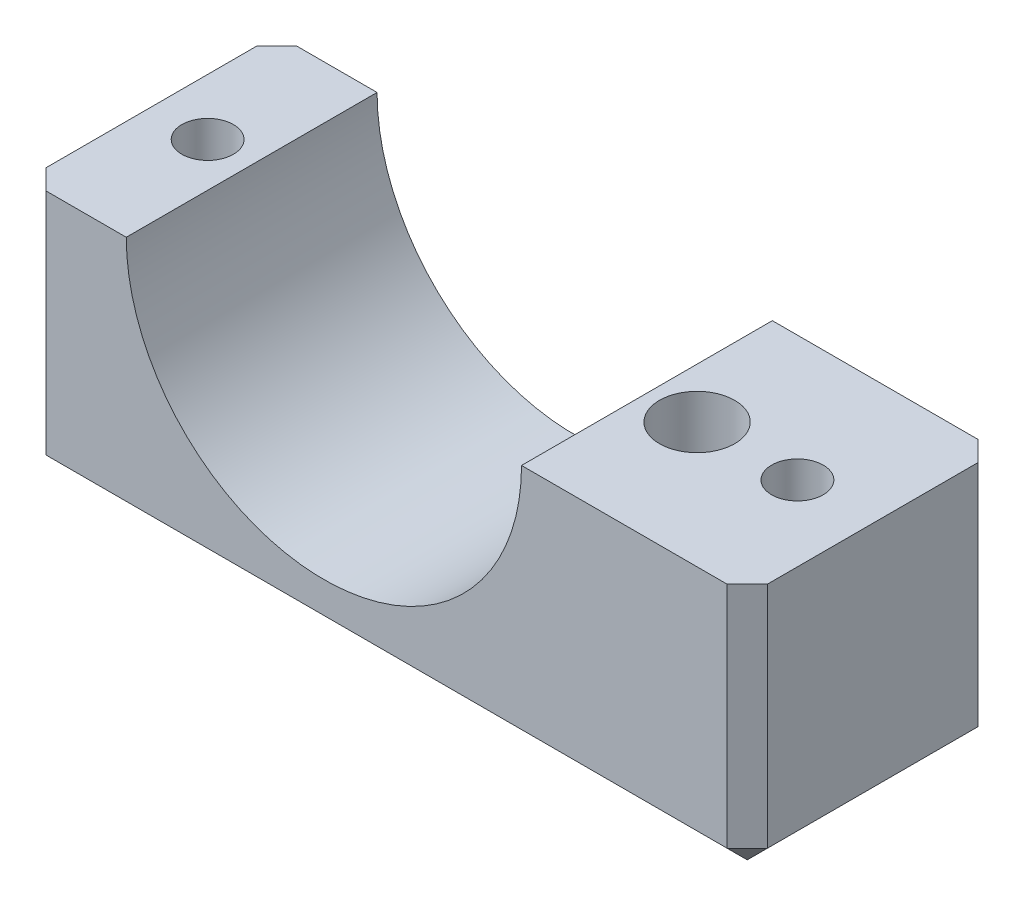
ISO-10303-21;
HEADER;
FILE_DESCRIPTION(('STEP AP214'),'2;1');
FILE_NAME('part.step','',(''),(''),'','','');
FILE_SCHEMA(('AUTOMOTIVE_DESIGN { 1 0 10303 214 1 1 1 1 }'));
ENDSEC;
DATA;
#1=APPLICATION_CONTEXT('core data for automotive mechanical design processes');
#2=APPLICATION_PROTOCOL_DEFINITION('international standard','automotive_design',2000,#1);
#3=PRODUCT_CONTEXT('',#1,'mechanical');
#4=PRODUCT('Part','Part','',(#3));
#5=PRODUCT_RELATED_PRODUCT_CATEGORY('part','',(#4));
#6=PRODUCT_DEFINITION_FORMATION('','',#4);
#7=PRODUCT_DEFINITION_CONTEXT('part definition',#1,'design');
#8=PRODUCT_DEFINITION('design','',#6,#7);
#9=PRODUCT_DEFINITION_SHAPE('','',#8);
#10=(LENGTH_UNIT() NAMED_UNIT(*) SI_UNIT(.MILLI.,.METRE.));
#11=(NAMED_UNIT(*) PLANE_ANGLE_UNIT() SI_UNIT($,.RADIAN.));
#12=(NAMED_UNIT(*) SI_UNIT($,.STERADIAN.) SOLID_ANGLE_UNIT());
#13=UNCERTAINTY_MEASURE_WITH_UNIT(LENGTH_MEASURE(1.E-05),#10,'distance_accuracy_value','');
#14=(GEOMETRIC_REPRESENTATION_CONTEXT(3) GLOBAL_UNCERTAINTY_ASSIGNED_CONTEXT((#13)) GLOBAL_UNIT_ASSIGNED_CONTEXT((#10,
#11,#12)) REPRESENTATION_CONTEXT('',''));
#15=CARTESIAN_POINT('',(0.,0.,0.));
#16=DIRECTION('',(0.,0.,1.));
#17=DIRECTION('',(1.,0.,0.));
#18=AXIS2_PLACEMENT_3D('',#15,#16,#17);
#19=CARTESIAN_POINT('',(0.,-31.496,31.75));
#20=DIRECTION('',(1.,0.,0.));
#21=DIRECTION('',(0.,0.,-1.));
#22=AXIS2_PLACEMENT_3D('',#19,#20,#21);
#23=PLANE('',#22);
#24=DIRECTION('',(0.,0.,1.));
#25=VECTOR('',#24,1.);
#26=CARTESIAN_POINT('',(0.,-28.956,31.75));
#27=LINE('',#26,#25);
#28=CARTESIAN_POINT('',(0.,-28.956,2.53999999999999));
#29=VERTEX_POINT('',#28);
#30=CARTESIAN_POINT('',(0.,-28.956,29.21));
#31=VERTEX_POINT('',#30);
#32=EDGE_CURVE('E189',#29,#31,#27,.T.);
#33=ORIENTED_EDGE('',*,*,#32,.T.);
#34=DIRECTION('',(0.,1.,0.));
#35=VECTOR('',#34,1.);
#36=CARTESIAN_POINT('',(0.,0.,29.21));
#37=LINE('',#36,#35);
#38=CARTESIAN_POINT('',(0.,0.,29.21));
#39=VERTEX_POINT('',#38);
#40=EDGE_CURVE('E191',#31,#39,#37,.T.);
#41=ORIENTED_EDGE('',*,*,#40,.T.);
#42=DIRECTION('',(0.,0.,-1.));
#43=VECTOR('',#42,1.);
#44=CARTESIAN_POINT('',(0.,0.,31.75));
#45=LINE('',#44,#43);
#46=CARTESIAN_POINT('',(0.,0.,2.53999999999999));
#47=VERTEX_POINT('',#46);
#48=EDGE_CURVE('E151',#39,#47,#45,.T.);
#49=ORIENTED_EDGE('',*,*,#48,.T.);
#50=DIRECTION('',(0.,-1.,0.));
#51=VECTOR('',#50,1.);
#52=CARTESIAN_POINT('',(0.,-31.496,2.53999999999999));
#53=LINE('',#52,#51);
#54=EDGE_CURVE('E187',#47,#29,#53,.T.);
#55=ORIENTED_EDGE('',*,*,#54,.T.);
#56=EDGE_LOOP('',(#33,#41,#49,#55));
#57=FACE_BOUND('',#56,.T.);
#58=ADVANCED_FACE('F37',(#57),#23,.F.);
#59=CARTESIAN_POINT('',(91.313,-31.496,31.75));
#60=DIRECTION('',(0.,1.,0.));
#61=DIRECTION('',(-1.,0.,0.));
#62=AXIS2_PLACEMENT_3D('',#59,#60,#61);
#63=PLANE('',#62);
#64=DIRECTION('',(1.,0.,0.));
#65=VECTOR('',#64,1.);
#66=CARTESIAN_POINT('',(91.313,-31.496,2.53999999999999));
#67=LINE('',#66,#65);
#68=CARTESIAN_POINT('',(2.53999999999999,-31.496,2.53999999999999));
#69=VERTEX_POINT('',#68);
#70=CARTESIAN_POINT('',(88.773,-31.496,2.53999999999999));
#71=VERTEX_POINT('',#70);
#72=EDGE_CURVE('E173',#69,#71,#67,.T.);
#73=ORIENTED_EDGE('',*,*,#72,.T.);
#74=DIRECTION('',(0.,0.,1.));
#75=VECTOR('',#74,1.);
#76=CARTESIAN_POINT('',(88.773,-31.496,31.75));
#77=LINE('',#76,#75);
#78=CARTESIAN_POINT('',(88.773,-31.496,29.21));
#79=VERTEX_POINT('',#78);
#80=EDGE_CURVE('E179',#71,#79,#77,.T.);
#81=ORIENTED_EDGE('',*,*,#80,.T.);
#82=DIRECTION('',(-1.,0.,0.));
#83=VECTOR('',#82,1.);
#84=CARTESIAN_POINT('',(0.,-31.496,29.21));
#85=LINE('',#84,#83);
#86=CARTESIAN_POINT('',(2.53999999999999,-31.496,29.21));
#87=VERTEX_POINT('',#86);
#88=EDGE_CURVE('E177',#79,#87,#85,.T.);
#89=ORIENTED_EDGE('',*,*,#88,.T.);
#90=DIRECTION('',(0.,0.,-1.));
#91=VECTOR('',#90,1.);
#92=CARTESIAN_POINT('',(2.53999999999999,-31.496,31.75));
#93=LINE('',#92,#91);
#94=EDGE_CURVE('E175',#87,#69,#93,.T.);
#95=ORIENTED_EDGE('',*,*,#94,.T.);
#96=EDGE_LOOP('',(#73,#81,#89,#95));
#97=FACE_BOUND('',#96,.T.);
#98=CARTESIAN_POINT('',(69.088,-31.496,15.875));
#99=DIRECTION('',(0.,-1.,0.));
#100=DIRECTION('',(0.,0.,-1.));
#101=AXIS2_PLACEMENT_3D('',#98,#99,#100);
#102=CIRCLE('',#101,4.76249999999999);
#103=CARTESIAN_POINT('',(69.088,-31.496,11.1125));
#104=VERTEX_POINT('',#103);
#105=EDGE_CURVE('E236',#104,#104,#102,.T.);
#106=ORIENTED_EDGE('',*,*,#105,.F.);
#107=EDGE_LOOP('',(#106));
#108=FACE_BOUND('',#107,.T.);
#109=CARTESIAN_POINT('',(7.12470000000001,-31.496,15.875));
#110=DIRECTION('',(0.,-1.,0.));
#111=DIRECTION('',(0.,0.,-1.));
#112=AXIS2_PLACEMENT_3D('',#109,#110,#111);
#113=CIRCLE('',#112,3.2639);
#114=CARTESIAN_POINT('',(7.12470000000001,-31.496,12.6111));
#115=VERTEX_POINT('',#114);
#116=EDGE_CURVE('E244',#115,#115,#113,.T.);
#117=ORIENTED_EDGE('',*,*,#116,.F.);
#118=EDGE_LOOP('',(#117));
#119=FACE_BOUND('',#118,.T.);
#120=CARTESIAN_POINT('',(81.788,-31.496,15.875));
#121=DIRECTION('',(0.,-1.,0.));
#122=DIRECTION('',(0.,0.,-1.));
#123=AXIS2_PLACEMENT_3D('',#120,#121,#122);
#124=CIRCLE('',#123,3.2639);
#125=CARTESIAN_POINT('',(81.788,-31.496,12.6111));
#126=VERTEX_POINT('',#125);
#127=EDGE_CURVE('E252',#126,#126,#124,.T.);
#128=ORIENTED_EDGE('',*,*,#127,.F.);
#129=EDGE_LOOP('',(#128));
#130=FACE_BOUND('',#129,.T.);
#131=ADVANCED_FACE('F266',(#97,#108,#119,#130),#63,.F.);
#132=CARTESIAN_POINT('',(91.313,0.,31.75));
#133=DIRECTION('',(-1.,0.,0.));
#134=DIRECTION('',(0.,0.,1.));
#135=AXIS2_PLACEMENT_3D('',#132,#133,#134);
#136=PLANE('',#135);
#137=DIRECTION('',(0.,0.,-1.));
#138=VECTOR('',#137,1.);
#139=CARTESIAN_POINT('',(91.313,0.,31.75));
#140=LINE('',#139,#138);
#141=CARTESIAN_POINT('',(91.313,0.,29.21));
#142=VERTEX_POINT('',#141);
#143=CARTESIAN_POINT('',(91.313,0.,2.53999999999999));
#144=VERTEX_POINT('',#143);
#145=EDGE_CURVE('E143',#142,#144,#140,.T.);
#146=ORIENTED_EDGE('',*,*,#145,.F.);
#147=DIRECTION('',(0.,-1.,0.));
#148=VECTOR('',#147,1.);
#149=CARTESIAN_POINT('',(91.313,-31.496,29.21));
#150=LINE('',#149,#148);
#151=CARTESIAN_POINT('',(91.313,-28.956,29.21));
#152=VERTEX_POINT('',#151);
#153=EDGE_CURVE('E171',#142,#152,#150,.T.);
#154=ORIENTED_EDGE('',*,*,#153,.T.);
#155=DIRECTION('',(0.,0.,-1.));
#156=VECTOR('',#155,1.);
#157=CARTESIAN_POINT('',(91.313,-28.956,31.75));
#158=LINE('',#157,#156);
#159=CARTESIAN_POINT('',(91.313,-28.956,2.53999999999999));
#160=VERTEX_POINT('',#159);
#161=EDGE_CURVE('E168',#152,#160,#158,.T.);
#162=ORIENTED_EDGE('',*,*,#161,.T.);
#163=DIRECTION('',(0.,1.,0.));
#164=VECTOR('',#163,1.);
#165=CARTESIAN_POINT('',(91.313,0.,2.53999999999999));
#166=LINE('',#165,#164);
#167=EDGE_CURVE('E166',#160,#144,#166,.T.);
#168=ORIENTED_EDGE('',*,*,#167,.T.);
#169=EDGE_LOOP('',(#146,#154,#162,#168));
#170=FACE_BOUND('',#169,.T.);
#171=ADVANCED_FACE('F268',(#170),#136,.F.);
#172=CARTESIAN_POINT('',(62.738,0.,31.75));
#173=DIRECTION('',(0.,-1.,0.));
#174=DIRECTION('',(0.,0.,-1.));
#175=AXIS2_PLACEMENT_3D('',#172,#173,#174);
#176=PLANE('',#175);
#177=CARTESIAN_POINT('',(69.088,0.,15.875));
#178=DIRECTION('',(0.,-1.,0.));
#179=DIRECTION('',(0.,0.,-1.));
#180=AXIS2_PLACEMENT_3D('',#177,#178,#179);
#181=CIRCLE('',#180,4.76249999999999);
#182=CARTESIAN_POINT('',(69.088,0.,11.1125));
#183=VERTEX_POINT('',#182);
#184=EDGE_CURVE('E239',#183,#183,#181,.T.);
#185=ORIENTED_EDGE('',*,*,#184,.T.);
#186=EDGE_LOOP('',(#185));
#187=FACE_BOUND('',#186,.T.);
#188=CARTESIAN_POINT('',(81.788,0.,15.875));
#189=DIRECTION('',(0.,-1.,0.));
#190=DIRECTION('',(0.,0.,-1.));
#191=AXIS2_PLACEMENT_3D('',#188,#189,#190);
#192=CIRCLE('',#191,3.26389999999999);
#193=CARTESIAN_POINT('',(81.788,0.,12.6111));
#194=VERTEX_POINT('',#193);
#195=EDGE_CURVE('E157',#194,#194,#192,.T.);
#196=ORIENTED_EDGE('',*,*,#195,.T.);
#197=EDGE_LOOP('',(#196));
#198=FACE_BOUND('',#197,.T.);
#199=DIRECTION('',(-1.,0.,0.));
#200=VECTOR('',#199,1.);
#201=CARTESIAN_POINT('',(62.738,0.,31.75));
#202=LINE('',#201,#200);
#203=CARTESIAN_POINT('',(88.773,0.,31.75));
#204=VERTEX_POINT('',#203);
#205=CARTESIAN_POINT('',(62.738,0.,31.75));
#206=VERTEX_POINT('',#205);
#207=EDGE_CURVE('E124',#204,#206,#202,.T.);
#208=ORIENTED_EDGE('',*,*,#207,.F.);
#209=DIRECTION('',(0.707106781186549,0.,-0.707106781186546));
#210=VECTOR('',#209,1.);
#211=CARTESIAN_POINT('',(88.773,0.,31.75));
#212=LINE('',#211,#210);
#213=EDGE_CURVE('E199',#204,#142,#212,.T.);
#214=ORIENTED_EDGE('',*,*,#213,.T.);
#215=ORIENTED_EDGE('',*,*,#145,.T.);
#216=DIRECTION('',(0.707106781186549,0.,0.707106781186546));
#217=VECTOR('',#216,1.);
#218=CARTESIAN_POINT('',(91.313,0.,2.53999999999999));
#219=LINE('',#218,#217);
#220=CARTESIAN_POINT('',(88.773,0.,0.));
#221=VERTEX_POINT('',#220);
#222=EDGE_CURVE('E197',#144,#221,#219,.F.);
#223=ORIENTED_EDGE('',*,*,#222,.T.);
#224=DIRECTION('',(-1.,0.,0.));
#225=VECTOR('',#224,1.);
#226=CARTESIAN_POINT('',(62.738,0.,0.));
#227=LINE('',#226,#225);
#228=CARTESIAN_POINT('',(62.738,0.,0.));
#229=VERTEX_POINT('',#228);
#230=EDGE_CURVE('E140',#221,#229,#227,.T.);
#231=ORIENTED_EDGE('',*,*,#230,.T.);
#232=DIRECTION('',(0.,0.,-1.));
#233=VECTOR('',#232,1.);
#234=CARTESIAN_POINT('',(62.738,0.,31.75));
#235=LINE('',#234,#233);
#236=EDGE_CURVE('E138',#206,#229,#235,.T.);
#237=ORIENTED_EDGE('',*,*,#236,.F.);
#238=EDGE_LOOP('',(#208,#214,#215,#223,#231,#237));
#239=FACE_BOUND('',#238,.T.);
#240=ADVANCED_FACE('F139',(#187,#198,#239),#176,.F.);
#241=CARTESIAN_POINT('',(37.719,0.,31.75));
#242=DIRECTION('',(0.,0.,-1.));
#243=DIRECTION('',(-1.,0.,0.));
#244=AXIS2_PLACEMENT_3D('',#241,#242,#243);
#245=CYLINDRICAL_SURFACE('',#244,25.019);
#246=CARTESIAN_POINT('',(37.719,0.,0.));
#247=DIRECTION('',(0.,0.,-1.));
#248=DIRECTION('',(1.,0.,0.));
#249=AXIS2_PLACEMENT_3D('',#246,#247,#248);
#250=CIRCLE('',#249,25.019);
#251=CARTESIAN_POINT('',(12.7,0.,0.));
#252=VERTEX_POINT('',#251);
#253=EDGE_CURVE('E156',#229,#252,#250,.T.);
#254=ORIENTED_EDGE('',*,*,#253,.T.);
#255=DIRECTION('',(0.,0.,-1.));
#256=VECTOR('',#255,1.);
#257=CARTESIAN_POINT('',(12.7,0.,31.75));
#258=LINE('',#257,#256);
#259=CARTESIAN_POINT('',(12.7,0.,31.75));
#260=VERTEX_POINT('',#259);
#261=EDGE_CURVE('E144',#260,#252,#258,.T.);
#262=ORIENTED_EDGE('',*,*,#261,.F.);
#263=CARTESIAN_POINT('',(37.719,0.,31.75));
#264=DIRECTION('',(0.,0.,-1.));
#265=DIRECTION('',(1.,0.,0.));
#266=AXIS2_PLACEMENT_3D('',#263,#264,#265);
#267=CIRCLE('',#266,25.019);
#268=EDGE_CURVE('E129',#206,#260,#267,.T.);
#269=ORIENTED_EDGE('',*,*,#268,.F.);
#270=ORIENTED_EDGE('',*,*,#236,.T.);
#271=EDGE_LOOP('',(#254,#262,#269,#270));
#272=FACE_BOUND('',#271,.T.);
#273=ADVANCED_FACE('F146',(#272),#245,.F.);
#274=CARTESIAN_POINT('',(0.,0.,31.75));
#275=DIRECTION('',(0.,-1.,0.));
#276=DIRECTION('',(0.,0.,-1.));
#277=AXIS2_PLACEMENT_3D('',#274,#275,#276);
#278=PLANE('',#277);
#279=CARTESIAN_POINT('',(7.12470000000001,0.,15.875));
#280=DIRECTION('',(0.,-1.,0.));
#281=DIRECTION('',(0.,0.,-1.));
#282=AXIS2_PLACEMENT_3D('',#279,#280,#281);
#283=CIRCLE('',#282,3.26389999999999);
#284=CARTESIAN_POINT('',(7.12470000000001,0.,12.6111));
#285=VERTEX_POINT('',#284);
#286=EDGE_CURVE('E249',#285,#285,#283,.T.);
#287=ORIENTED_EDGE('',*,*,#286,.T.);
#288=EDGE_LOOP('',(#287));
#289=FACE_BOUND('',#288,.T.);
#290=ORIENTED_EDGE('',*,*,#48,.F.);
#291=DIRECTION('',(0.707106781186546,0.,0.707106781186549));
#292=VECTOR('',#291,1.);
#293=CARTESIAN_POINT('',(2.53999999999999,0.,31.75));
#294=LINE('',#293,#292);
#295=CARTESIAN_POINT('',(2.53999999999999,0.,31.75));
#296=VERTEX_POINT('',#295);
#297=EDGE_CURVE('E195',#39,#296,#294,.T.);
#298=ORIENTED_EDGE('',*,*,#297,.T.);
#299=DIRECTION('',(-1.,0.,0.));
#300=VECTOR('',#299,1.);
#301=CARTESIAN_POINT('',(0.,0.,31.75));
#302=LINE('',#301,#300);
#303=EDGE_CURVE('E149',#260,#296,#302,.T.);
#304=ORIENTED_EDGE('',*,*,#303,.F.);
#305=ORIENTED_EDGE('',*,*,#261,.T.);
#306=DIRECTION('',(-1.,0.,0.));
#307=VECTOR('',#306,1.);
#308=CARTESIAN_POINT('',(0.,0.,0.));
#309=LINE('',#308,#307);
#310=CARTESIAN_POINT('',(2.54,0.,0.));
#311=VERTEX_POINT('',#310);
#312=EDGE_CURVE('E135',#252,#311,#309,.T.);
#313=ORIENTED_EDGE('',*,*,#312,.T.);
#314=DIRECTION('',(0.707106781186549,0.,-0.707106781186546));
#315=VECTOR('',#314,1.);
#316=CARTESIAN_POINT('',(0.,0.,2.53999999999999));
#317=LINE('',#316,#315);
#318=EDGE_CURVE('E193',#311,#47,#317,.F.);
#319=ORIENTED_EDGE('',*,*,#318,.T.);
#320=EDGE_LOOP('',(#290,#298,#304,#305,#313,#319));
#321=FACE_BOUND('',#320,.T.);
#322=ADVANCED_FACE('F333',(#289,#321),#278,.F.);
#323=CARTESIAN_POINT('',(37.719,0.,31.75));
#324=DIRECTION('',(0.,0.,1.));
#325=DIRECTION('',(1.,0.,0.));
#326=AXIS2_PLACEMENT_3D('',#323,#324,#325);
#327=PLANE('',#326);
#328=ORIENTED_EDGE('',*,*,#303,.T.);
#329=DIRECTION('',(0.,-1.,0.));
#330=VECTOR('',#329,1.);
#331=CARTESIAN_POINT('',(2.53999999999999,-31.496,31.75));
#332=LINE('',#331,#330);
#333=CARTESIAN_POINT('',(2.53999999999999,-28.956,31.75));
#334=VERTEX_POINT('',#333);
#335=EDGE_CURVE('E185',#296,#334,#332,.T.);
#336=ORIENTED_EDGE('',*,*,#335,.T.);
#337=DIRECTION('',(1.,0.,0.));
#338=VECTOR('',#337,1.);
#339=CARTESIAN_POINT('',(91.313,-28.956,31.75));
#340=LINE('',#339,#338);
#341=CARTESIAN_POINT('',(88.773,-28.956,31.75));
#342=VERTEX_POINT('',#341);
#343=EDGE_CURVE('E182',#334,#342,#340,.T.);
#344=ORIENTED_EDGE('',*,*,#343,.T.);
#345=DIRECTION('',(0.,1.,0.));
#346=VECTOR('',#345,1.);
#347=CARTESIAN_POINT('',(88.773,0.,31.75));
#348=LINE('',#347,#346);
#349=EDGE_CURVE('E132',#342,#204,#348,.T.);
#350=ORIENTED_EDGE('',*,*,#349,.T.);
#351=ORIENTED_EDGE('',*,*,#207,.T.);
#352=ORIENTED_EDGE('',*,*,#268,.T.);
#353=EDGE_LOOP('',(#328,#336,#344,#350,#351,#352));
#354=FACE_BOUND('',#353,.T.);
#355=ADVANCED_FACE('F127',(#354),#327,.T.);
#356=CARTESIAN_POINT('',(37.719,0.,0.));
#357=DIRECTION('',(0.,0.,1.));
#358=DIRECTION('',(1.,0.,0.));
#359=AXIS2_PLACEMENT_3D('',#356,#357,#358);
#360=PLANE('',#359);
#361=DIRECTION('',(-1.,0.,0.));
#362=VECTOR('',#361,1.);
#363=CARTESIAN_POINT('',(37.719,-28.956,0.));
#364=LINE('',#363,#362);
#365=CARTESIAN_POINT('',(88.773,-28.956,0.));
#366=VERTEX_POINT('',#365);
#367=CARTESIAN_POINT('',(2.54,-28.956,0.));
#368=VERTEX_POINT('',#367);
#369=EDGE_CURVE('E46',#366,#368,#364,.T.);
#370=ORIENTED_EDGE('',*,*,#369,.T.);
#371=DIRECTION('',(0.,1.,0.));
#372=VECTOR('',#371,1.);
#373=CARTESIAN_POINT('',(2.54,0.,0.));
#374=LINE('',#373,#372);
#375=EDGE_CURVE('E11',#368,#311,#374,.T.);
#376=ORIENTED_EDGE('',*,*,#375,.T.);
#377=ORIENTED_EDGE('',*,*,#312,.F.);
#378=ORIENTED_EDGE('',*,*,#253,.F.);
#379=ORIENTED_EDGE('',*,*,#230,.F.);
#380=DIRECTION('',(0.,-1.,0.));
#381=VECTOR('',#380,1.);
#382=CARTESIAN_POINT('',(88.773,0.,0.));
#383=LINE('',#382,#381);
#384=EDGE_CURVE('E57',#221,#366,#383,.T.);
#385=ORIENTED_EDGE('',*,*,#384,.T.);
#386=EDGE_LOOP('',(#370,#376,#377,#378,#379,#385));
#387=FACE_BOUND('',#386,.T.);
#388=ADVANCED_FACE('F262',(#387),#360,.F.);
#389=CARTESIAN_POINT('',(81.788,-31.496,15.875));
#390=DIRECTION('',(0.,-1.,0.));
#391=DIRECTION('',(0.,0.,-1.));
#392=AXIS2_PLACEMENT_3D('',#389,#390,#391);
#393=CYLINDRICAL_SURFACE('',#392,3.26389999999999);
#394=ORIENTED_EDGE('',*,*,#195,.F.);
#395=EDGE_LOOP('',(#394));
#396=FACE_BOUND('',#395,.T.);
#397=ORIENTED_EDGE('',*,*,#127,.T.);
#398=EDGE_LOOP('',(#397));
#399=FACE_BOUND('',#398,.T.);
#400=ADVANCED_FACE('F258',(#396,#399),#393,.F.);
#401=CARTESIAN_POINT('',(7.12470000000001,-31.496,15.875));
#402=DIRECTION('',(0.,-1.,0.));
#403=DIRECTION('',(0.,0.,-1.));
#404=AXIS2_PLACEMENT_3D('',#401,#402,#403);
#405=CYLINDRICAL_SURFACE('',#404,3.2639);
#406=ORIENTED_EDGE('',*,*,#286,.F.);
#407=EDGE_LOOP('',(#406));
#408=FACE_BOUND('',#407,.T.);
#409=ORIENTED_EDGE('',*,*,#116,.T.);
#410=EDGE_LOOP('',(#409));
#411=FACE_BOUND('',#410,.T.);
#412=ADVANCED_FACE('F261',(#408,#411),#405,.F.);
#413=CARTESIAN_POINT('',(69.088,-31.496,15.875));
#414=DIRECTION('',(0.,-1.,0.));
#415=DIRECTION('',(0.,0.,-1.));
#416=AXIS2_PLACEMENT_3D('',#413,#414,#415);
#417=CYLINDRICAL_SURFACE('',#416,4.76249999999999);
#418=ORIENTED_EDGE('',*,*,#184,.F.);
#419=EDGE_LOOP('',(#418));
#420=FACE_BOUND('',#419,.T.);
#421=ORIENTED_EDGE('',*,*,#105,.T.);
#422=EDGE_LOOP('',(#421));
#423=FACE_BOUND('',#422,.T.);
#424=ADVANCED_FACE('F326',(#420,#423),#417,.F.);
#425=CARTESIAN_POINT('',(2.53999999999999,0.,31.75));
#426=DIRECTION('',(-0.707106781186549,0.,0.707106781186546));
#427=DIRECTION('',(0.,1.,0.));
#428=AXIS2_PLACEMENT_3D('',#425,#426,#427);
#429=PLANE('',#428);
#430=ORIENTED_EDGE('',*,*,#297,.F.);
#431=ORIENTED_EDGE('',*,*,#40,.F.);
#432=DIRECTION('',(-0.707106781186546,0.,-0.707106781186549));
#433=VECTOR('',#432,1.);
#434=CARTESIAN_POINT('',(2.53999999999999,-28.956,31.75));
#435=LINE('',#434,#433);
#436=EDGE_CURVE('E230',#334,#31,#435,.T.);
#437=ORIENTED_EDGE('',*,*,#436,.F.);
#438=ORIENTED_EDGE('',*,*,#335,.F.);
#439=EDGE_LOOP('',(#430,#431,#437,#438));
#440=FACE_BOUND('',#439,.T.);
#441=ADVANCED_FACE('F39',(#440),#429,.T.);
#442=CARTESIAN_POINT('',(0.,-31.496,2.53999999999999));
#443=DIRECTION('',(0.707106781186546,0.,0.707106781186549));
#444=DIRECTION('',(0.,-1.,0.));
#445=AXIS2_PLACEMENT_3D('',#442,#443,#444);
#446=PLANE('',#445);
#447=ORIENTED_EDGE('',*,*,#318,.F.);
#448=ORIENTED_EDGE('',*,*,#375,.F.);
#449=DIRECTION('',(-0.707106781186549,0.,0.707106781186545));
#450=VECTOR('',#449,1.);
#451=CARTESIAN_POINT('',(1.27,-28.956,1.26999999999999));
#452=LINE('',#451,#450);
#453=EDGE_CURVE('E228',#29,#368,#452,.F.);
#454=ORIENTED_EDGE('',*,*,#453,.F.);
#455=ORIENTED_EDGE('',*,*,#54,.F.);
#456=EDGE_LOOP('',(#447,#448,#454,#455));
#457=FACE_BOUND('',#456,.T.);
#458=ADVANCED_FACE('F319',(#457),#446,.F.);
#459=CARTESIAN_POINT('',(2.53999999999999,-31.496,31.75));
#460=DIRECTION('',(0.707106781186549,0.707106781186546,0.));
#461=DIRECTION('',(0.,0.,-1.));
#462=AXIS2_PLACEMENT_3D('',#459,#460,#461);
#463=PLANE('',#462);
#464=DIRECTION('',(-0.707106781186546,0.707106781186549,0.));
#465=VECTOR('',#464,1.);
#466=CARTESIAN_POINT('',(1.26999999999999,-30.226,29.21));
#467=LINE('',#466,#465);
#468=EDGE_CURVE('E41',#31,#87,#467,.F.);
#469=ORIENTED_EDGE('',*,*,#468,.F.);
#470=ORIENTED_EDGE('',*,*,#32,.F.);
#471=DIRECTION('',(0.707106781186545,-0.707106781186549,0.));
#472=VECTOR('',#471,1.);
#473=CARTESIAN_POINT('',(2.53999999999999,-31.496,2.53999999999999));
#474=LINE('',#473,#472);
#475=EDGE_CURVE('E225',#69,#29,#474,.F.);
#476=ORIENTED_EDGE('',*,*,#475,.F.);
#477=ORIENTED_EDGE('',*,*,#94,.F.);
#478=EDGE_LOOP('',(#469,#470,#476,#477));
#479=FACE_BOUND('',#478,.T.);
#480=ADVANCED_FACE('F317',(#479),#463,.F.);
#481=CARTESIAN_POINT('',(2.53999999999999,-28.956,31.75));
#482=DIRECTION('',(-0.577350269189629,-0.577350269189626,0.577350269189623));
#483=DIRECTION('',(0.707106781186545,-0.707106781186549,0.));
#484=AXIS2_PLACEMENT_3D('',#481,#482,#483);
#485=PLANE('',#484);
#486=ORIENTED_EDGE('',*,*,#436,.T.);
#487=ORIENTED_EDGE('',*,*,#468,.T.);
#488=DIRECTION('',(0.,0.707106781186546,0.707106781186549));
#489=VECTOR('',#488,1.);
#490=CARTESIAN_POINT('',(2.53999999999998,-28.956,31.75));
#491=LINE('',#490,#489);
#492=EDGE_CURVE('E222',#334,#87,#491,.F.);
#493=ORIENTED_EDGE('',*,*,#492,.F.);
#494=EDGE_LOOP('',(#486,#487,#493));
#495=FACE_BOUND('',#494,.T.);
#496=ADVANCED_FACE('F313',(#495),#485,.T.);
#497=CARTESIAN_POINT('',(2.53999999999999,-31.496,2.53999999999999));
#498=DIRECTION('',(-0.577350269189626,-0.577350269189623,-0.577350269189629));
#499=DIRECTION('',(-0.707106781186549,0.,0.707106781186546));
#500=AXIS2_PLACEMENT_3D('',#497,#498,#499);
#501=PLANE('',#500);
#502=ORIENTED_EDGE('',*,*,#475,.T.);
#503=ORIENTED_EDGE('',*,*,#453,.T.);
#504=DIRECTION('',(0.,0.70710678118655,-0.707106781186545));
#505=VECTOR('',#504,1.);
#506=CARTESIAN_POINT('',(2.53999999999999,-31.496,2.53999999999999));
#507=LINE('',#506,#505);
#508=EDGE_CURVE('E219',#69,#368,#507,.T.);
#509=ORIENTED_EDGE('',*,*,#508,.F.);
#510=EDGE_LOOP('',(#502,#503,#509));
#511=FACE_BOUND('',#510,.T.);
#512=ADVANCED_FACE('F309',(#511),#501,.T.);
#513=CARTESIAN_POINT('',(37.719,-28.956,31.75));
#514=DIRECTION('',(0.,-0.707106781186549,0.707106781186546));
#515=DIRECTION('',(-1.,0.,0.));
#516=AXIS2_PLACEMENT_3D('',#513,#514,#515);
#517=PLANE('',#516);
#518=ORIENTED_EDGE('',*,*,#492,.T.);
#519=ORIENTED_EDGE('',*,*,#88,.F.);
#520=DIRECTION('',(0.,-0.707106781186546,-0.707106781186549));
#521=VECTOR('',#520,1.);
#522=CARTESIAN_POINT('',(88.773,-31.496,29.21));
#523=LINE('',#522,#521);
#524=EDGE_CURVE('E216',#342,#79,#523,.T.);
#525=ORIENTED_EDGE('',*,*,#524,.F.);
#526=ORIENTED_EDGE('',*,*,#343,.F.);
#527=EDGE_LOOP('',(#518,#519,#525,#526));
#528=FACE_BOUND('',#527,.T.);
#529=ADVANCED_FACE('F305',(#528),#517,.T.);
#530=CARTESIAN_POINT('',(88.773,0.,31.75));
#531=DIRECTION('',(0.707106781186546,0.,0.707106781186549));
#532=DIRECTION('',(0.,-1.,0.));
#533=AXIS2_PLACEMENT_3D('',#530,#531,#532);
#534=PLANE('',#533);
#535=ORIENTED_EDGE('',*,*,#213,.F.);
#536=ORIENTED_EDGE('',*,*,#349,.F.);
#537=DIRECTION('',(-0.707106781186549,0.,0.707106781186545));
#538=VECTOR('',#537,1.);
#539=CARTESIAN_POINT('',(90.043,-28.956,30.48));
#540=LINE('',#539,#538);
#541=EDGE_CURVE('E213',#152,#342,#540,.T.);
#542=ORIENTED_EDGE('',*,*,#541,.F.);
#543=ORIENTED_EDGE('',*,*,#153,.F.);
#544=EDGE_LOOP('',(#535,#536,#542,#543));
#545=FACE_BOUND('',#544,.T.);
#546=ADVANCED_FACE('F301',(#545),#534,.T.);
#547=CARTESIAN_POINT('',(91.313,0.,2.53999999999999));
#548=DIRECTION('',(-0.707106781186546,0.,0.707106781186549));
#549=DIRECTION('',(0.,1.,0.));
#550=AXIS2_PLACEMENT_3D('',#547,#548,#549);
#551=PLANE('',#550);
#552=ORIENTED_EDGE('',*,*,#222,.F.);
#553=ORIENTED_EDGE('',*,*,#167,.F.);
#554=DIRECTION('',(-0.707106781186549,0.,-0.707106781186546));
#555=VECTOR('',#554,1.);
#556=CARTESIAN_POINT('',(91.313,-28.956,2.53999999999999));
#557=LINE('',#556,#555);
#558=EDGE_CURVE('E210',#366,#160,#557,.F.);
#559=ORIENTED_EDGE('',*,*,#558,.F.);
#560=ORIENTED_EDGE('',*,*,#384,.F.);
#561=EDGE_LOOP('',(#552,#553,#559,#560));
#562=FACE_BOUND('',#561,.T.);
#563=ADVANCED_FACE('F297',(#562),#551,.F.);
#564=CARTESIAN_POINT('',(91.313,-31.496,2.53999999999999));
#565=DIRECTION('',(0.,0.707106781186545,0.70710678118655));
#566=DIRECTION('',(1.,0.,0.));
#567=AXIS2_PLACEMENT_3D('',#564,#565,#566);
#568=PLANE('',#567);
#569=ORIENTED_EDGE('',*,*,#508,.T.);
#570=ORIENTED_EDGE('',*,*,#369,.F.);
#571=DIRECTION('',(0.,-0.70710678118655,0.707106781186545));
#572=VECTOR('',#571,1.);
#573=CARTESIAN_POINT('',(88.773,-30.226,1.26999999999999));
#574=LINE('',#573,#572);
#575=EDGE_CURVE('E207',#71,#366,#574,.F.);
#576=ORIENTED_EDGE('',*,*,#575,.F.);
#577=ORIENTED_EDGE('',*,*,#72,.F.);
#578=EDGE_LOOP('',(#569,#570,#576,#577));
#579=FACE_BOUND('',#578,.T.);
#580=ADVANCED_FACE('F293',(#579),#568,.F.);
#581=CARTESIAN_POINT('',(88.773,-31.496,29.21));
#582=DIRECTION('',(0.577350269189623,-0.577350269189629,0.577350269189626));
#583=DIRECTION('',(0.,-0.707106781186546,-0.707106781186549));
#584=AXIS2_PLACEMENT_3D('',#581,#582,#583);
#585=PLANE('',#584);
#586=ORIENTED_EDGE('',*,*,#541,.T.);
#587=ORIENTED_EDGE('',*,*,#524,.T.);
#588=DIRECTION('',(-0.707106781186549,-0.707106781186546,0.));
#589=VECTOR('',#588,1.);
#590=CARTESIAN_POINT('',(88.773,-31.496,29.21));
#591=LINE('',#590,#589);
#592=EDGE_CURVE('E205',#152,#79,#591,.T.);
#593=ORIENTED_EDGE('',*,*,#592,.F.);
#594=EDGE_LOOP('',(#586,#587,#593));
#595=FACE_BOUND('',#594,.T.);
#596=ADVANCED_FACE('F289',(#595),#585,.T.);
#597=CARTESIAN_POINT('',(91.313,-28.956,2.53999999999999));
#598=DIRECTION('',(0.577350269189623,-0.577350269189626,-0.577350269189629));
#599=DIRECTION('',(0.,0.707106781186549,-0.707106781186545));
#600=AXIS2_PLACEMENT_3D('',#597,#598,#599);
#601=PLANE('',#600);
#602=ORIENTED_EDGE('',*,*,#575,.T.);
#603=ORIENTED_EDGE('',*,*,#558,.T.);
#604=DIRECTION('',(0.707106781186549,0.707106781186545,0.));
#605=VECTOR('',#604,1.);
#606=CARTESIAN_POINT('',(91.313,-28.956,2.53999999999999));
#607=LINE('',#606,#605);
#608=EDGE_CURVE('E203',#71,#160,#607,.T.);
#609=ORIENTED_EDGE('',*,*,#608,.F.);
#610=EDGE_LOOP('',(#602,#603,#609));
#611=FACE_BOUND('',#610,.T.);
#612=ADVANCED_FACE('F285',(#611),#601,.T.);
#613=CARTESIAN_POINT('',(91.313,-28.956,31.75));
#614=DIRECTION('',(-0.707106781186546,0.707106781186549,0.));
#615=DIRECTION('',(0.,0.,-1.));
#616=AXIS2_PLACEMENT_3D('',#613,#614,#615);
#617=PLANE('',#616);
#618=ORIENTED_EDGE('',*,*,#592,.T.);
#619=ORIENTED_EDGE('',*,*,#80,.F.);
#620=ORIENTED_EDGE('',*,*,#608,.T.);
#621=ORIENTED_EDGE('',*,*,#161,.F.);
#622=EDGE_LOOP('',(#618,#619,#620,#621));
#623=FACE_BOUND('',#622,.T.);
#624=ADVANCED_FACE('F282',(#623),#617,.F.);
#625=CLOSED_SHELL('',(#58,#131,#171,#240,#273,#322,#355,#388,#400,#412,#424,#441,#458,#480,#496,
#512,#529,#546,#563,#580,#596,#612,#624));
#626=MANIFOLD_SOLID_BREP('B2',#625);
#627=ADVANCED_BREP_SHAPE_REPRESENTATION('',(#18,#626),#14);
#628=SHAPE_DEFINITION_REPRESENTATION(#9,#627);
ENDSEC;
END-ISO-10303-21;
